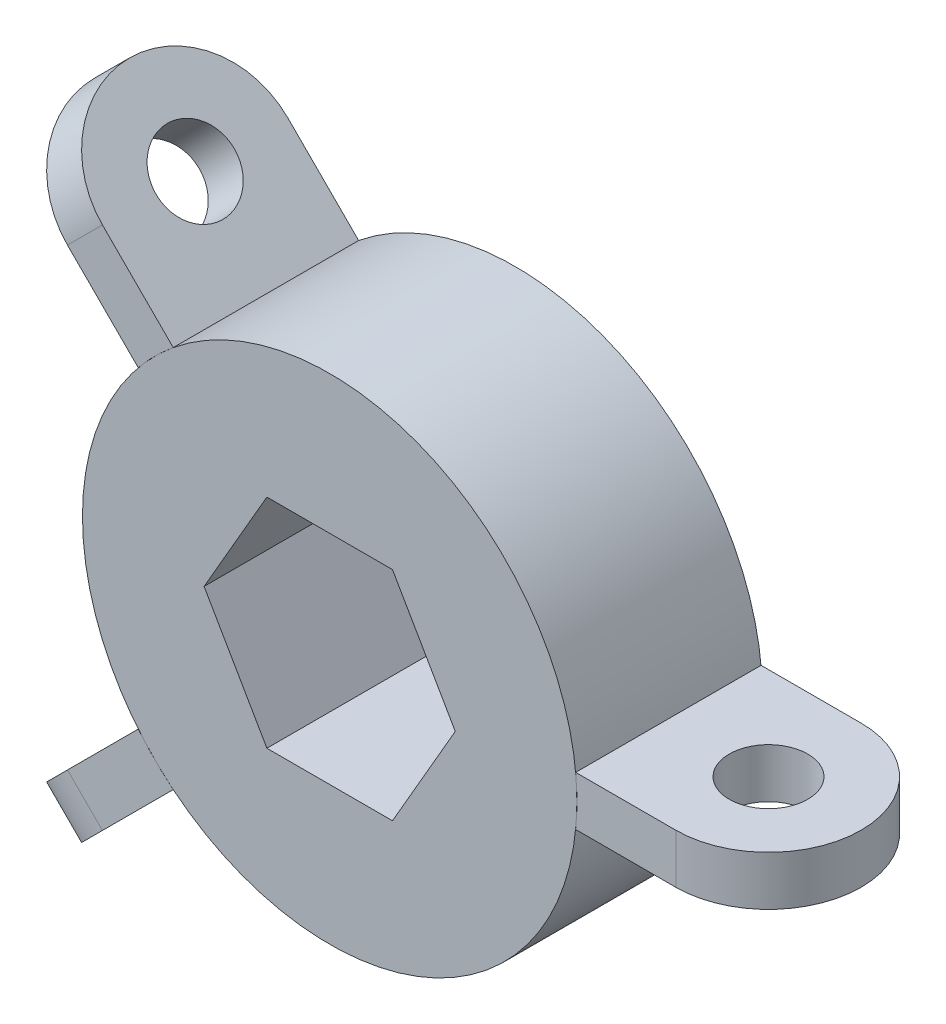
ISO-10303-21;
HEADER;
FILE_DESCRIPTION(('STEP AP214'),'2;1');
FILE_NAME('part.step','',(''),(''),'','','');
FILE_SCHEMA(('AUTOMOTIVE_DESIGN { 1 0 10303 214 1 1 1 1 }'));
ENDSEC;
DATA;
#1=APPLICATION_CONTEXT('core data for automotive mechanical design processes');
#2=APPLICATION_PROTOCOL_DEFINITION('international standard','automotive_design',2000,#1);
#3=PRODUCT_CONTEXT('',#1,'mechanical');
#4=PRODUCT('Part','Part','',(#3));
#5=PRODUCT_RELATED_PRODUCT_CATEGORY('part','',(#4));
#6=PRODUCT_DEFINITION_FORMATION('','',#4);
#7=PRODUCT_DEFINITION_CONTEXT('part definition',#1,'design');
#8=PRODUCT_DEFINITION('design','',#6,#7);
#9=PRODUCT_DEFINITION_SHAPE('','',#8);
#10=(LENGTH_UNIT() NAMED_UNIT(*) SI_UNIT(.MILLI.,.METRE.));
#11=(NAMED_UNIT(*) PLANE_ANGLE_UNIT() SI_UNIT($,.RADIAN.));
#12=(NAMED_UNIT(*) SI_UNIT($,.STERADIAN.) SOLID_ANGLE_UNIT());
#13=UNCERTAINTY_MEASURE_WITH_UNIT(LENGTH_MEASURE(1.E-05),#10,'distance_accuracy_value','');
#14=(GEOMETRIC_REPRESENTATION_CONTEXT(3) GLOBAL_UNCERTAINTY_ASSIGNED_CONTEXT((#13)) GLOBAL_UNIT_ASSIGNED_CONTEXT((#10,
#11,#12)) REPRESENTATION_CONTEXT('',''));
#15=CARTESIAN_POINT('',(0.,0.,0.));
#16=DIRECTION('',(0.,0.,1.));
#17=DIRECTION('',(1.,0.,0.));
#18=AXIS2_PLACEMENT_3D('',#15,#16,#17);
#19=CARTESIAN_POINT('',(-19.7989898732232,19.7989898732235,15.));
#20=DIRECTION('',(0.,0.,1.));
#21=DIRECTION('',(-0.707106781186541,0.707106781186554,0.));
#22=AXIS2_PLACEMENT_3D('',#19,#20,#21);
#23=PLANE('',#22);
#24=CARTESIAN_POINT('',(0.,0.,15.));
#25=DIRECTION('',(0.,0.,-1.));
#26=DIRECTION('',(0.707106781186541,-0.707106781186554,0.));
#27=AXIS2_PLACEMENT_3D('',#24,#25,#26);
#28=CIRCLE('',#27,20.);
#29=CARTESIAN_POINT('',(-12.6570337170971,15.4854608418435,15.));
#30=VERTEX_POINT('',#29);
#31=CARTESIAN_POINT('',(-15.4854608418433,12.6570337170973,15.));
#32=VERTEX_POINT('',#31);
#33=EDGE_CURVE('E95',#30,#32,#28,.F.);
#34=ORIENTED_EDGE('',*,*,#33,.F.);
#35=DIRECTION('',(0.707106781186541,-0.707106781186554,0.));
#36=VECTOR('',#35,1.);
#37=CARTESIAN_POINT('',(-18.3847763108501,21.2132034355966,15.));
#38=LINE('',#37,#36);
#39=CARTESIAN_POINT('',(-18.3847763108501,21.2132034355966,15.));
#40=VERTEX_POINT('',#39);
#41=EDGE_CURVE('E12',#40,#30,#38,.T.);
#42=ORIENTED_EDGE('',*,*,#41,.F.);
#43=DIRECTION('',(-0.707106781186554,-0.707106781186541,0.));
#44=VECTOR('',#43,1.);
#45=CARTESIAN_POINT('',(-19.7989898732232,19.7989898732235,15.));
#46=LINE('',#45,#44);
#47=CARTESIAN_POINT('',(-21.2132034355963,18.3847763108504,15.));
#48=VERTEX_POINT('',#47);
#49=EDGE_CURVE('E86',#40,#48,#46,.T.);
#50=ORIENTED_EDGE('',*,*,#49,.T.);
#51=DIRECTION('',(0.707106781186541,-0.707106781186554,0.));
#52=VECTOR('',#51,1.);
#53=CARTESIAN_POINT('',(-21.2132034355963,18.3847763108504,15.));
#54=LINE('',#53,#52);
#55=EDGE_CURVE('E89',#48,#32,#54,.T.);
#56=ORIENTED_EDGE('',*,*,#55,.T.);
#57=EDGE_LOOP('',(#34,#42,#50,#56));
#58=FACE_BOUND('',#57,.T.);
#59=ADVANCED_FACE('F48',(#58),#23,.T.);
#60=CARTESIAN_POINT('',(-18.3847763108501,21.2132034355966,0.));
#61=DIRECTION('',(0.707106781186554,0.707106781186541,0.));
#62=DIRECTION('',(0.,0.,-1.));
#63=AXIS2_PLACEMENT_3D('',#60,#61,#62);
#64=PLANE('',#63);
#65=CARTESIAN_POINT('',(-18.3847763108501,21.2132034355966,7.5));
#66=DIRECTION('',(0.707106781186554,0.707106781186541,0.));
#67=DIRECTION('',(0.,0.,-1.));
#68=AXIS2_PLACEMENT_3D('',#65,#66,#67);
#69=CIRCLE('',#68,3.175);
#70=CARTESIAN_POINT('',(-18.3847763108501,21.2132034355966,4.325));
#71=VERTEX_POINT('',#70);
#72=EDGE_CURVE('E151',#71,#71,#69,.T.);
#73=ORIENTED_EDGE('',*,*,#72,.F.);
#74=EDGE_LOOP('',(#73));
#75=FACE_BOUND('',#74,.T.);
#76=ORIENTED_EDGE('',*,*,#41,.T.);
#77=DIRECTION('',(0.,0.,-1.));
#78=VECTOR('',#77,1.);
#79=CARTESIAN_POINT('',(-12.6570337170971,15.4854608418435,15.));
#80=LINE('',#79,#78);
#81=CARTESIAN_POINT('',(-12.6570337170971,15.4854608418435,0.));
#82=VERTEX_POINT('',#81);
#83=EDGE_CURVE('E106',#82,#30,#80,.F.);
#84=ORIENTED_EDGE('',*,*,#83,.F.);
#85=DIRECTION('',(0.707106781186541,-0.707106781186554,0.));
#86=VECTOR('',#85,1.);
#87=CARTESIAN_POINT('',(-18.3847763108501,21.2132034355966,0.));
#88=LINE('',#87,#86);
#89=CARTESIAN_POINT('',(-18.3847763108501,21.2132034355966,0.));
#90=VERTEX_POINT('',#89);
#91=EDGE_CURVE('E55',#90,#82,#88,.T.);
#92=ORIENTED_EDGE('',*,*,#91,.F.);
#93=CARTESIAN_POINT('',(-18.3847763108501,21.2132034355966,7.5));
#94=DIRECTION('',(0.707106781186554,0.707106781186541,0.));
#95=DIRECTION('',(0.,0.,1.));
#96=AXIS2_PLACEMENT_3D('',#93,#94,#95);
#97=CIRCLE('',#96,7.5);
#98=EDGE_CURVE('E107',#90,#40,#97,.T.);
#99=ORIENTED_EDGE('',*,*,#98,.T.);
#100=EDGE_LOOP('',(#76,#84,#92,#99));
#101=FACE_BOUND('',#100,.T.);
#102=ADVANCED_FACE('F125',(#75,#101),#64,.T.);
#103=CARTESIAN_POINT('',(-19.7989898732232,19.7989898732235,0.));
#104=DIRECTION('',(0.,0.,1.));
#105=DIRECTION('',(0.707106781186554,0.707106781186541,0.));
#106=AXIS2_PLACEMENT_3D('',#103,#104,#105);
#107=PLANE('',#106);
#108=ORIENTED_EDGE('',*,*,#91,.T.);
#109=CARTESIAN_POINT('',(0.,0.,0.));
#110=DIRECTION('',(0.,0.,-1.));
#111=DIRECTION('',(-0.707106781186554,-0.707106781186541,0.));
#112=AXIS2_PLACEMENT_3D('',#109,#110,#111);
#113=CIRCLE('',#112,20.);
#114=CARTESIAN_POINT('',(-15.4854608418433,12.6570337170973,0.));
#115=VERTEX_POINT('',#114);
#116=EDGE_CURVE('E110',#82,#115,#113,.F.);
#117=ORIENTED_EDGE('',*,*,#116,.T.);
#118=DIRECTION('',(0.707106781186541,-0.707106781186554,0.));
#119=VECTOR('',#118,1.);
#120=CARTESIAN_POINT('',(-21.2132034355963,18.3847763108504,0.));
#121=LINE('',#120,#119);
#122=CARTESIAN_POINT('',(-21.2132034355963,18.3847763108504,0.));
#123=VERTEX_POINT('',#122);
#124=EDGE_CURVE('E62',#123,#115,#121,.T.);
#125=ORIENTED_EDGE('',*,*,#124,.F.);
#126=DIRECTION('',(-0.707106781186554,-0.707106781186541,0.));
#127=VECTOR('',#126,1.);
#128=CARTESIAN_POINT('',(-19.7989898732232,19.7989898732235,0.));
#129=LINE('',#128,#127);
#130=EDGE_CURVE('E94',#90,#123,#129,.T.);
#131=ORIENTED_EDGE('',*,*,#130,.F.);
#132=EDGE_LOOP('',(#108,#117,#125,#131));
#133=FACE_BOUND('',#132,.T.);
#134=ADVANCED_FACE('F122',(#133),#107,.F.);
#135=CARTESIAN_POINT('',(-21.2132034355963,18.3847763108504,0.));
#136=DIRECTION('',(0.707106781186554,0.707106781186541,0.));
#137=DIRECTION('',(0.,0.,-1.));
#138=AXIS2_PLACEMENT_3D('',#135,#136,#137);
#139=PLANE('',#138);
#140=CARTESIAN_POINT('',(-21.2132034355963,18.3847763108504,7.5));
#141=DIRECTION('',(0.707106781186554,0.707106781186541,0.));
#142=DIRECTION('',(0.,0.,-1.));
#143=AXIS2_PLACEMENT_3D('',#140,#141,#142);
#144=CIRCLE('',#143,3.175);
#145=CARTESIAN_POINT('',(-21.2132034355963,18.3847763108504,4.325));
#146=VERTEX_POINT('',#145);
#147=EDGE_CURVE('E112',#146,#146,#144,.F.);
#148=ORIENTED_EDGE('',*,*,#147,.F.);
#149=EDGE_LOOP('',(#148));
#150=FACE_BOUND('',#149,.T.);
#151=ORIENTED_EDGE('',*,*,#124,.T.);
#152=DIRECTION('',(0.,0.,-1.));
#153=VECTOR('',#152,1.);
#154=CARTESIAN_POINT('',(-15.4854608418433,12.6570337170973,15.));
#155=LINE('',#154,#153);
#156=EDGE_CURVE('E103',#115,#32,#155,.F.);
#157=ORIENTED_EDGE('',*,*,#156,.T.);
#158=ORIENTED_EDGE('',*,*,#55,.F.);
#159=CARTESIAN_POINT('',(-21.2132034355963,18.3847763108504,7.5));
#160=DIRECTION('',(0.707106781186554,0.707106781186541,0.));
#161=DIRECTION('',(0.,0.,-1.));
#162=AXIS2_PLACEMENT_3D('',#159,#160,#161);
#163=CIRCLE('',#162,7.5);
#164=EDGE_CURVE('E100',#48,#123,#163,.F.);
#165=ORIENTED_EDGE('',*,*,#164,.T.);
#166=EDGE_LOOP('',(#151,#157,#158,#165));
#167=FACE_BOUND('',#166,.T.);
#168=ADVANCED_FACE('F99',(#150,#167),#139,.F.);
#169=CARTESIAN_POINT('',(0.,0.,15.));
#170=DIRECTION('',(0.,0.,-1.));
#171=DIRECTION('',(0.707106781186541,-0.707106781186554,0.));
#172=AXIS2_PLACEMENT_3D('',#169,#170,#171);
#173=CYLINDRICAL_SURFACE('',#172,20.);
#174=ORIENTED_EDGE('',*,*,#116,.F.);
#175=ORIENTED_EDGE('',*,*,#83,.T.);
#176=ORIENTED_EDGE('',*,*,#33,.T.);
#177=ORIENTED_EDGE('',*,*,#156,.F.);
#178=EDGE_LOOP('',(#174,#175,#176,#177));
#179=FACE_BOUND('',#178,.T.);
#180=ADVANCED_FACE('F124',(#179),#173,.F.);
#181=CARTESIAN_POINT('',(-33.0717446612278,6.5262350852191,7.5));
#182=DIRECTION('',(0.707106781186554,0.707106781186541,0.));
#183=DIRECTION('',(0.,0.,-1.));
#184=AXIS2_PLACEMENT_3D('',#181,#182,#183);
#185=CYLINDRICAL_SURFACE('',#184,7.5);
#186=ORIENTED_EDGE('',*,*,#164,.F.);
#187=ORIENTED_EDGE('',*,*,#49,.F.);
#188=ORIENTED_EDGE('',*,*,#98,.F.);
#189=ORIENTED_EDGE('',*,*,#130,.T.);
#190=EDGE_LOOP('',(#186,#187,#188,#189));
#191=FACE_BOUND('',#190,.T.);
#192=ADVANCED_FACE('F105',(#191),#185,.T.);
#193=CARTESIAN_POINT('',(-27.5632034355963,12.0347763108505,7.5));
#194=DIRECTION('',(0.707106781186554,0.707106781186541,0.));
#195=DIRECTION('',(0.,0.,-1.));
#196=AXIS2_PLACEMENT_3D('',#193,#194,#195);
#197=CYLINDRICAL_SURFACE('',#196,3.175);
#198=ORIENTED_EDGE('',*,*,#147,.T.);
#199=EDGE_LOOP('',(#198));
#200=FACE_BOUND('',#199,.T.);
#201=ORIENTED_EDGE('',*,*,#72,.T.);
#202=EDGE_LOOP('',(#201));
#203=FACE_BOUND('',#202,.T.);
#204=ADVANCED_FACE('F142',(#200,#203),#197,.F.);
#205=CLOSED_SHELL('',(#59,#102,#134,#168,#180,#192,#204));
#206=MANIFOLD_SOLID_BREP('B2',#205);
#207=CARTESIAN_POINT('',(-19.7989898732234,-19.7989898732232,15.));
#208=DIRECTION('',(0.,0.,1.));
#209=DIRECTION('',(-0.707106781186551,-0.707106781186544,0.));
#210=AXIS2_PLACEMENT_3D('',#207,#208,#209);
#211=PLANE('',#210);
#212=CARTESIAN_POINT('',(0.,0.,15.));
#213=DIRECTION('',(0.,0.,-1.));
#214=DIRECTION('',(0.707106781186551,0.707106781186544,0.));
#215=AXIS2_PLACEMENT_3D('',#212,#213,#214);
#216=CIRCLE('',#215,20.);
#217=CARTESIAN_POINT('',(-15.4854608418434,-12.6570337170971,15.));
#218=VERTEX_POINT('',#217);
#219=CARTESIAN_POINT('',(-12.6570337170973,-15.4854608418433,15.));
#220=VERTEX_POINT('',#219);
#221=EDGE_CURVE('E259',#218,#220,#216,.F.);
#222=ORIENTED_EDGE('',*,*,#221,.F.);
#223=DIRECTION('',(0.707106781186551,0.707106781186544,0.));
#224=VECTOR('',#223,1.);
#225=CARTESIAN_POINT('',(-21.2132034355965,-18.3847763108501,15.));
#226=LINE('',#225,#224);
#227=CARTESIAN_POINT('',(-21.2132034355965,-18.3847763108501,15.));
#228=VERTEX_POINT('',#227);
#229=EDGE_CURVE('E46',#228,#218,#226,.T.);
#230=ORIENTED_EDGE('',*,*,#229,.F.);
#231=DIRECTION('',(0.707106781186544,-0.707106781186551,0.));
#232=VECTOR('',#231,1.);
#233=CARTESIAN_POINT('',(-19.7989898732234,-19.7989898732232,15.));
#234=LINE('',#233,#232);
#235=CARTESIAN_POINT('',(-18.3847763108503,-21.2132034355963,15.));
#236=VERTEX_POINT('',#235);
#237=EDGE_CURVE('E250',#228,#236,#234,.T.);
#238=ORIENTED_EDGE('',*,*,#237,.T.);
#239=DIRECTION('',(0.707106781186551,0.707106781186544,0.));
#240=VECTOR('',#239,1.);
#241=CARTESIAN_POINT('',(-18.3847763108503,-21.2132034355963,15.));
#242=LINE('',#241,#240);
#243=EDGE_CURVE('E253',#236,#220,#242,.T.);
#244=ORIENTED_EDGE('',*,*,#243,.T.);
#245=EDGE_LOOP('',(#222,#230,#238,#244));
#246=FACE_BOUND('',#245,.T.);
#247=ADVANCED_FACE('F212',(#246),#211,.T.);
#248=CARTESIAN_POINT('',(-21.2132034355965,-18.3847763108501,0.));
#249=DIRECTION('',(-0.707106781186544,0.707106781186551,0.));
#250=DIRECTION('',(0.,0.,-1.));
#251=AXIS2_PLACEMENT_3D('',#248,#249,#250);
#252=PLANE('',#251);
#253=CARTESIAN_POINT('',(-21.2132034355965,-18.3847763108501,7.5));
#254=DIRECTION('',(-0.707106781186544,0.707106781186551,0.));
#255=DIRECTION('',(0.,0.,-1.));
#256=AXIS2_PLACEMENT_3D('',#253,#254,#255);
#257=CIRCLE('',#256,3.175);
#258=CARTESIAN_POINT('',(-21.2132034355965,-18.3847763108501,4.325));
#259=VERTEX_POINT('',#258);
#260=EDGE_CURVE('E315',#259,#259,#257,.T.);
#261=ORIENTED_EDGE('',*,*,#260,.F.);
#262=EDGE_LOOP('',(#261));
#263=FACE_BOUND('',#262,.T.);
#264=ORIENTED_EDGE('',*,*,#229,.T.);
#265=DIRECTION('',(0.,0.,-1.));
#266=VECTOR('',#265,1.);
#267=CARTESIAN_POINT('',(-15.4854608418434,-12.6570337170971,15.));
#268=LINE('',#267,#266);
#269=CARTESIAN_POINT('',(-15.4854608418434,-12.6570337170971,0.));
#270=VERTEX_POINT('',#269);
#271=EDGE_CURVE('E270',#270,#218,#268,.F.);
#272=ORIENTED_EDGE('',*,*,#271,.F.);
#273=DIRECTION('',(0.707106781186551,0.707106781186544,0.));
#274=VECTOR('',#273,1.);
#275=CARTESIAN_POINT('',(-21.2132034355965,-18.3847763108501,0.));
#276=LINE('',#275,#274);
#277=CARTESIAN_POINT('',(-21.2132034355965,-18.3847763108501,0.));
#278=VERTEX_POINT('',#277);
#279=EDGE_CURVE('E219',#278,#270,#276,.T.);
#280=ORIENTED_EDGE('',*,*,#279,.F.);
#281=CARTESIAN_POINT('',(-21.2132034355965,-18.3847763108501,7.5));
#282=DIRECTION('',(-0.707106781186544,0.707106781186551,0.));
#283=DIRECTION('',(0.,0.,1.));
#284=AXIS2_PLACEMENT_3D('',#281,#282,#283);
#285=CIRCLE('',#284,7.5);
#286=EDGE_CURVE('E271',#278,#228,#285,.T.);
#287=ORIENTED_EDGE('',*,*,#286,.T.);
#288=EDGE_LOOP('',(#264,#272,#280,#287));
#289=FACE_BOUND('',#288,.T.);
#290=ADVANCED_FACE('F289',(#263,#289),#252,.T.);
#291=CARTESIAN_POINT('',(-19.7989898732234,-19.7989898732232,0.));
#292=DIRECTION('',(0.,0.,1.));
#293=DIRECTION('',(-0.707106781186544,0.707106781186551,0.));
#294=AXIS2_PLACEMENT_3D('',#291,#292,#293);
#295=PLANE('',#294);
#296=ORIENTED_EDGE('',*,*,#279,.T.);
#297=CARTESIAN_POINT('',(0.,0.,0.));
#298=DIRECTION('',(0.,0.,-1.));
#299=DIRECTION('',(0.707106781186544,-0.707106781186551,0.));
#300=AXIS2_PLACEMENT_3D('',#297,#298,#299);
#301=CIRCLE('',#300,20.);
#302=CARTESIAN_POINT('',(-12.6570337170973,-15.4854608418433,0.));
#303=VERTEX_POINT('',#302);
#304=EDGE_CURVE('E274',#270,#303,#301,.F.);
#305=ORIENTED_EDGE('',*,*,#304,.T.);
#306=DIRECTION('',(0.707106781186551,0.707106781186544,0.));
#307=VECTOR('',#306,1.);
#308=CARTESIAN_POINT('',(-18.3847763108503,-21.2132034355963,0.));
#309=LINE('',#308,#307);
#310=CARTESIAN_POINT('',(-18.3847763108503,-21.2132034355963,0.));
#311=VERTEX_POINT('',#310);
#312=EDGE_CURVE('E226',#311,#303,#309,.T.);
#313=ORIENTED_EDGE('',*,*,#312,.F.);
#314=DIRECTION('',(0.707106781186544,-0.707106781186551,0.));
#315=VECTOR('',#314,1.);
#316=CARTESIAN_POINT('',(-19.7989898732234,-19.7989898732232,0.));
#317=LINE('',#316,#315);
#318=EDGE_CURVE('E258',#278,#311,#317,.T.);
#319=ORIENTED_EDGE('',*,*,#318,.F.);
#320=EDGE_LOOP('',(#296,#305,#313,#319));
#321=FACE_BOUND('',#320,.T.);
#322=ADVANCED_FACE('F286',(#321),#295,.F.);
#323=CARTESIAN_POINT('',(-18.3847763108503,-21.2132034355963,0.));
#324=DIRECTION('',(-0.707106781186544,0.707106781186551,0.));
#325=DIRECTION('',(0.,0.,-1.));
#326=AXIS2_PLACEMENT_3D('',#323,#324,#325);
#327=PLANE('',#326);
#328=CARTESIAN_POINT('',(-18.3847763108503,-21.2132034355963,7.5));
#329=DIRECTION('',(-0.707106781186544,0.707106781186551,0.));
#330=DIRECTION('',(0.,0.,-1.));
#331=AXIS2_PLACEMENT_3D('',#328,#329,#330);
#332=CIRCLE('',#331,3.175);
#333=CARTESIAN_POINT('',(-18.3847763108503,-21.2132034355963,4.325));
#334=VERTEX_POINT('',#333);
#335=EDGE_CURVE('E276',#334,#334,#332,.F.);
#336=ORIENTED_EDGE('',*,*,#335,.F.);
#337=EDGE_LOOP('',(#336));
#338=FACE_BOUND('',#337,.T.);
#339=ORIENTED_EDGE('',*,*,#312,.T.);
#340=DIRECTION('',(0.,0.,-1.));
#341=VECTOR('',#340,1.);
#342=CARTESIAN_POINT('',(-12.6570337170973,-15.4854608418433,15.));
#343=LINE('',#342,#341);
#344=EDGE_CURVE('E267',#303,#220,#343,.F.);
#345=ORIENTED_EDGE('',*,*,#344,.T.);
#346=ORIENTED_EDGE('',*,*,#243,.F.);
#347=CARTESIAN_POINT('',(-18.3847763108503,-21.2132034355963,7.5));
#348=DIRECTION('',(-0.707106781186544,0.707106781186551,0.));
#349=DIRECTION('',(0.,0.,-1.));
#350=AXIS2_PLACEMENT_3D('',#347,#348,#349);
#351=CIRCLE('',#350,7.5);
#352=EDGE_CURVE('E264',#236,#311,#351,.F.);
#353=ORIENTED_EDGE('',*,*,#352,.T.);
#354=EDGE_LOOP('',(#339,#345,#346,#353));
#355=FACE_BOUND('',#354,.T.);
#356=ADVANCED_FACE('F263',(#338,#355),#327,.F.);
#357=CARTESIAN_POINT('',(0.,0.,15.));
#358=DIRECTION('',(0.,0.,-1.));
#359=DIRECTION('',(0.707106781186551,0.707106781186544,0.));
#360=AXIS2_PLACEMENT_3D('',#357,#358,#359);
#361=CYLINDRICAL_SURFACE('',#360,20.);
#362=ORIENTED_EDGE('',*,*,#304,.F.);
#363=ORIENTED_EDGE('',*,*,#271,.T.);
#364=ORIENTED_EDGE('',*,*,#221,.T.);
#365=ORIENTED_EDGE('',*,*,#344,.F.);
#366=EDGE_LOOP('',(#362,#363,#364,#365));
#367=FACE_BOUND('',#366,.T.);
#368=ADVANCED_FACE('F288',(#367),#361,.F.);
#369=CARTESIAN_POINT('',(-6.52623508521899,-33.0717446612278,7.5));
#370=DIRECTION('',(-0.707106781186544,0.707106781186551,0.));
#371=DIRECTION('',(0.,0.,-1.));
#372=AXIS2_PLACEMENT_3D('',#369,#370,#371);
#373=CYLINDRICAL_SURFACE('',#372,7.5);
#374=ORIENTED_EDGE('',*,*,#352,.F.);
#375=ORIENTED_EDGE('',*,*,#237,.F.);
#376=ORIENTED_EDGE('',*,*,#286,.F.);
#377=ORIENTED_EDGE('',*,*,#318,.T.);
#378=EDGE_LOOP('',(#374,#375,#376,#377));
#379=FACE_BOUND('',#378,.T.);
#380=ADVANCED_FACE('F269',(#379),#373,.T.);
#381=CARTESIAN_POINT('',(-12.0347763108504,-27.5632034355964,7.5));
#382=DIRECTION('',(-0.707106781186544,0.707106781186551,0.));
#383=DIRECTION('',(0.,0.,-1.));
#384=AXIS2_PLACEMENT_3D('',#381,#382,#383);
#385=CYLINDRICAL_SURFACE('',#384,3.175);
#386=ORIENTED_EDGE('',*,*,#335,.T.);
#387=EDGE_LOOP('',(#386));
#388=FACE_BOUND('',#387,.T.);
#389=ORIENTED_EDGE('',*,*,#260,.T.);
#390=EDGE_LOOP('',(#389));
#391=FACE_BOUND('',#390,.T.);
#392=ADVANCED_FACE('F306',(#388,#391),#385,.F.);
#393=CLOSED_SHELL('',(#247,#290,#322,#356,#368,#380,#392));
#394=MANIFOLD_SOLID_BREP('B6',#393);
#395=CARTESIAN_POINT('',(28.,0.,15.));
#396=DIRECTION('',(0.,0.,1.));
#397=DIRECTION('',(1.,0.,0.));
#398=AXIS2_PLACEMENT_3D('',#395,#396,#397);
#399=PLANE('',#398);
#400=CARTESIAN_POINT('',(0.,0.,15.));
#401=DIRECTION('',(0.,0.,-1.));
#402=DIRECTION('',(-1.,0.,0.));
#403=AXIS2_PLACEMENT_3D('',#400,#401,#402);
#404=CIRCLE('',#403,20.);
#405=CARTESIAN_POINT('',(19.8997487421324,-2.,15.));
#406=VERTEX_POINT('',#405);
#407=CARTESIAN_POINT('',(19.8997487421324,2.,15.));
#408=VERTEX_POINT('',#407);
#409=EDGE_CURVE('E422',#406,#408,#404,.F.);
#410=ORIENTED_EDGE('',*,*,#409,.F.);
#411=DIRECTION('',(-1.,0.,0.));
#412=VECTOR('',#411,1.);
#413=CARTESIAN_POINT('',(28.,-2.,15.));
#414=LINE('',#413,#412);
#415=CARTESIAN_POINT('',(28.,-2.,15.));
#416=VERTEX_POINT('',#415);
#417=EDGE_CURVE('E210',#416,#406,#414,.T.);
#418=ORIENTED_EDGE('',*,*,#417,.F.);
#419=DIRECTION('',(0.,1.,0.));
#420=VECTOR('',#419,1.);
#421=CARTESIAN_POINT('',(28.,0.,15.));
#422=LINE('',#421,#420);
#423=CARTESIAN_POINT('',(28.,2.,15.));
#424=VERTEX_POINT('',#423);
#425=EDGE_CURVE('E413',#416,#424,#422,.T.);
#426=ORIENTED_EDGE('',*,*,#425,.T.);
#427=DIRECTION('',(-1.,0.,0.));
#428=VECTOR('',#427,1.);
#429=CARTESIAN_POINT('',(28.,2.,15.));
#430=LINE('',#429,#428);
#431=EDGE_CURVE('E416',#424,#408,#430,.T.);
#432=ORIENTED_EDGE('',*,*,#431,.T.);
#433=EDGE_LOOP('',(#410,#418,#426,#432));
#434=FACE_BOUND('',#433,.T.);
#435=ADVANCED_FACE('F375',(#434),#399,.T.);
#436=CARTESIAN_POINT('',(28.,-2.,0.));
#437=DIRECTION('',(0.,-1.,0.));
#438=DIRECTION('',(0.,0.,-1.));
#439=AXIS2_PLACEMENT_3D('',#436,#437,#438);
#440=PLANE('',#439);
#441=CARTESIAN_POINT('',(28.,-2.,7.5));
#442=DIRECTION('',(0.,-1.,0.));
#443=DIRECTION('',(0.,0.,-1.));
#444=AXIS2_PLACEMENT_3D('',#441,#442,#443);
#445=CIRCLE('',#444,3.175);
#446=CARTESIAN_POINT('',(28.,-2.,4.325));
#447=VERTEX_POINT('',#446);
#448=EDGE_CURVE('E478',#447,#447,#445,.T.);
#449=ORIENTED_EDGE('',*,*,#448,.F.);
#450=EDGE_LOOP('',(#449));
#451=FACE_BOUND('',#450,.T.);
#452=ORIENTED_EDGE('',*,*,#417,.T.);
#453=DIRECTION('',(0.,0.,-1.));
#454=VECTOR('',#453,1.);
#455=CARTESIAN_POINT('',(19.8997487421324,-2.,15.));
#456=LINE('',#455,#454);
#457=CARTESIAN_POINT('',(19.8997487421324,-2.,0.));
#458=VERTEX_POINT('',#457);
#459=EDGE_CURVE('E433',#458,#406,#456,.F.);
#460=ORIENTED_EDGE('',*,*,#459,.F.);
#461=DIRECTION('',(-1.,0.,0.));
#462=VECTOR('',#461,1.);
#463=CARTESIAN_POINT('',(28.,-2.,0.));
#464=LINE('',#463,#462);
#465=CARTESIAN_POINT('',(28.,-2.,0.));
#466=VERTEX_POINT('',#465);
#467=EDGE_CURVE('E382',#466,#458,#464,.T.);
#468=ORIENTED_EDGE('',*,*,#467,.F.);
#469=CARTESIAN_POINT('',(28.,-2.,7.5));
#470=DIRECTION('',(0.,-1.,0.));
#471=DIRECTION('',(0.,0.,1.));
#472=AXIS2_PLACEMENT_3D('',#469,#470,#471);
#473=CIRCLE('',#472,7.5);
#474=EDGE_CURVE('E434',#466,#416,#473,.T.);
#475=ORIENTED_EDGE('',*,*,#474,.T.);
#476=EDGE_LOOP('',(#452,#460,#468,#475));
#477=FACE_BOUND('',#476,.T.);
#478=ADVANCED_FACE('F452',(#451,#477),#440,.T.);
#479=CARTESIAN_POINT('',(28.,0.,0.));
#480=DIRECTION('',(0.,0.,1.));
#481=DIRECTION('',(0.,-1.,0.));
#482=AXIS2_PLACEMENT_3D('',#479,#480,#481);
#483=PLANE('',#482);
#484=ORIENTED_EDGE('',*,*,#467,.T.);
#485=CARTESIAN_POINT('',(0.,0.,0.));
#486=DIRECTION('',(0.,0.,-1.));
#487=DIRECTION('',(0.,1.,0.));
#488=AXIS2_PLACEMENT_3D('',#485,#486,#487);
#489=CIRCLE('',#488,20.);
#490=CARTESIAN_POINT('',(19.8997487421324,2.,0.));
#491=VERTEX_POINT('',#490);
#492=EDGE_CURVE('E437',#458,#491,#489,.F.);
#493=ORIENTED_EDGE('',*,*,#492,.T.);
#494=DIRECTION('',(-1.,0.,0.));
#495=VECTOR('',#494,1.);
#496=CARTESIAN_POINT('',(28.,2.,0.));
#497=LINE('',#496,#495);
#498=CARTESIAN_POINT('',(28.,2.,0.));
#499=VERTEX_POINT('',#498);
#500=EDGE_CURVE('E389',#499,#491,#497,.T.);
#501=ORIENTED_EDGE('',*,*,#500,.F.);
#502=DIRECTION('',(0.,1.,0.));
#503=VECTOR('',#502,1.);
#504=CARTESIAN_POINT('',(28.,0.,0.));
#505=LINE('',#504,#503);
#506=EDGE_CURVE('E421',#466,#499,#505,.T.);
#507=ORIENTED_EDGE('',*,*,#506,.F.);
#508=EDGE_LOOP('',(#484,#493,#501,#507));
#509=FACE_BOUND('',#508,.T.);
#510=ADVANCED_FACE('F449',(#509),#483,.F.);
#511=CARTESIAN_POINT('',(28.,2.,0.));
#512=DIRECTION('',(0.,-1.,0.));
#513=DIRECTION('',(0.,0.,-1.));
#514=AXIS2_PLACEMENT_3D('',#511,#512,#513);
#515=PLANE('',#514);
#516=CARTESIAN_POINT('',(28.,2.,7.5));
#517=DIRECTION('',(0.,-1.,0.));
#518=DIRECTION('',(0.,0.,-1.));
#519=AXIS2_PLACEMENT_3D('',#516,#517,#518);
#520=CIRCLE('',#519,3.175);
#521=CARTESIAN_POINT('',(28.,2.,4.325));
#522=VERTEX_POINT('',#521);
#523=EDGE_CURVE('E439',#522,#522,#520,.F.);
#524=ORIENTED_EDGE('',*,*,#523,.F.);
#525=EDGE_LOOP('',(#524));
#526=FACE_BOUND('',#525,.T.);
#527=ORIENTED_EDGE('',*,*,#500,.T.);
#528=DIRECTION('',(0.,0.,-1.));
#529=VECTOR('',#528,1.);
#530=CARTESIAN_POINT('',(19.8997487421324,2.,15.));
#531=LINE('',#530,#529);
#532=EDGE_CURVE('E430',#491,#408,#531,.F.);
#533=ORIENTED_EDGE('',*,*,#532,.T.);
#534=ORIENTED_EDGE('',*,*,#431,.F.);
#535=CARTESIAN_POINT('',(28.,2.,7.5));
#536=DIRECTION('',(0.,-1.,0.));
#537=DIRECTION('',(0.,0.,-1.));
#538=AXIS2_PLACEMENT_3D('',#535,#536,#537);
#539=CIRCLE('',#538,7.5);
#540=EDGE_CURVE('E427',#424,#499,#539,.F.);
#541=ORIENTED_EDGE('',*,*,#540,.T.);
#542=EDGE_LOOP('',(#527,#533,#534,#541));
#543=FACE_BOUND('',#542,.T.);
#544=ADVANCED_FACE('F426',(#526,#543),#515,.F.);
#545=CARTESIAN_POINT('',(0.,0.,15.));
#546=DIRECTION('',(0.,0.,-1.));
#547=DIRECTION('',(-1.,0.,0.));
#548=AXIS2_PLACEMENT_3D('',#545,#546,#547);
#549=CYLINDRICAL_SURFACE('',#548,20.);
#550=ORIENTED_EDGE('',*,*,#492,.F.);
#551=ORIENTED_EDGE('',*,*,#459,.T.);
#552=ORIENTED_EDGE('',*,*,#409,.T.);
#553=ORIENTED_EDGE('',*,*,#532,.F.);
#554=EDGE_LOOP('',(#550,#551,#552,#553));
#555=FACE_BOUND('',#554,.T.);
#556=ADVANCED_FACE('F451',(#555),#549,.F.);
#557=CARTESIAN_POINT('',(28.,18.7705098312484,7.5));
#558=DIRECTION('',(0.,-1.,0.));
#559=DIRECTION('',(0.,0.,-1.));
#560=AXIS2_PLACEMENT_3D('',#557,#558,#559);
#561=CYLINDRICAL_SURFACE('',#560,7.5);
#562=ORIENTED_EDGE('',*,*,#540,.F.);
#563=ORIENTED_EDGE('',*,*,#425,.F.);
#564=ORIENTED_EDGE('',*,*,#474,.F.);
#565=ORIENTED_EDGE('',*,*,#506,.T.);
#566=EDGE_LOOP('',(#562,#563,#564,#565));
#567=FACE_BOUND('',#566,.T.);
#568=ADVANCED_FACE('F432',(#567),#561,.T.);
#569=CARTESIAN_POINT('',(28.,10.9802561210692,7.5));
#570=DIRECTION('',(0.,-1.,0.));
#571=DIRECTION('',(0.,0.,-1.));
#572=AXIS2_PLACEMENT_3D('',#569,#570,#571);
#573=CYLINDRICAL_SURFACE('',#572,3.175);
#574=ORIENTED_EDGE('',*,*,#523,.T.);
#575=EDGE_LOOP('',(#574));
#576=FACE_BOUND('',#575,.T.);
#577=ORIENTED_EDGE('',*,*,#448,.T.);
#578=EDGE_LOOP('',(#577));
#579=FACE_BOUND('',#578,.T.);
#580=ADVANCED_FACE('F469',(#576,#579),#573,.F.);
#581=CLOSED_SHELL('',(#435,#478,#510,#544,#556,#568,#580));
#582=MANIFOLD_SOLID_BREP('B40',#581);
#583=CARTESIAN_POINT('',(0.,0.,15.));
#584=DIRECTION('',(0.,0.,1.));
#585=DIRECTION('',(1.,0.,0.));
#586=AXIS2_PLACEMENT_3D('',#583,#584,#585);
#587=PLANE('',#586);
#588=DIRECTION('',(-0.5,-0.866025403784439,0.));
#589=VECTOR('',#588,1.);
#590=CARTESIAN_POINT('',(10.16,0.,15.));
#591=LINE('',#590,#589);
#592=CARTESIAN_POINT('',(10.16,0.,15.));
#593=VERTEX_POINT('',#592);
#594=CARTESIAN_POINT('',(5.08,-8.7988181024499,15.));
#595=VERTEX_POINT('',#594);
#596=EDGE_CURVE('E591',#593,#595,#591,.T.);
#597=ORIENTED_EDGE('',*,*,#596,.T.);
#598=DIRECTION('',(-1.,0.,0.));
#599=VECTOR('',#598,1.);
#600=CARTESIAN_POINT('',(5.08,-8.7988181024499,15.));
#601=LINE('',#600,#599);
#602=CARTESIAN_POINT('',(-5.08,-8.7988181024499,15.));
#603=VERTEX_POINT('',#602);
#604=EDGE_CURVE('E581',#595,#603,#601,.T.);
#605=ORIENTED_EDGE('',*,*,#604,.T.);
#606=DIRECTION('',(-0.5,0.866025403784439,0.));
#607=VECTOR('',#606,1.);
#608=CARTESIAN_POINT('',(-5.08,-8.7988181024499,15.));
#609=LINE('',#608,#607);
#610=CARTESIAN_POINT('',(-10.16,0.,15.));
#611=VERTEX_POINT('',#610);
#612=EDGE_CURVE('E630',#603,#611,#609,.T.);
#613=ORIENTED_EDGE('',*,*,#612,.T.);
#614=DIRECTION('',(0.5,0.866025403784439,0.));
#615=VECTOR('',#614,1.);
#616=CARTESIAN_POINT('',(-10.16,0.,15.));
#617=LINE('',#616,#615);
#618=CARTESIAN_POINT('',(-5.08,8.7988181024499,15.));
#619=VERTEX_POINT('',#618);
#620=EDGE_CURVE('E640',#611,#619,#617,.T.);
#621=ORIENTED_EDGE('',*,*,#620,.T.);
#622=DIRECTION('',(1.,0.,0.));
#623=VECTOR('',#622,1.);
#624=CARTESIAN_POINT('',(-5.08,8.7988181024499,15.));
#625=LINE('',#624,#623);
#626=CARTESIAN_POINT('',(5.08,8.7988181024499,15.));
#627=VERTEX_POINT('',#626);
#628=EDGE_CURVE('E602',#619,#627,#625,.T.);
#629=ORIENTED_EDGE('',*,*,#628,.T.);
#630=DIRECTION('',(0.5,-0.866025403784439,0.));
#631=VECTOR('',#630,1.);
#632=CARTESIAN_POINT('',(5.08,8.7988181024499,15.));
#633=LINE('',#632,#631);
#634=EDGE_CURVE('E598',#627,#593,#633,.T.);
#635=ORIENTED_EDGE('',*,*,#634,.T.);
#636=EDGE_LOOP('',(#597,#605,#613,#621,#629,#635));
#637=FACE_BOUND('',#636,.T.);
#638=CARTESIAN_POINT('',(0.,0.,15.));
#639=DIRECTION('',(0.,0.,1.));
#640=DIRECTION('',(1.,0.,0.));
#641=AXIS2_PLACEMENT_3D('',#638,#639,#640);
#642=CIRCLE('',#641,20.);
#643=CARTESIAN_POINT('',(20.,0.,15.));
#644=VERTEX_POINT('',#643);
#645=EDGE_CURVE('E373',#644,#644,#642,.T.);
#646=ORIENTED_EDGE('',*,*,#645,.T.);
#647=EDGE_LOOP('',(#646));
#648=FACE_BOUND('',#647,.T.);
#649=ADVANCED_FACE('F529',(#637,#648),#587,.T.);
#650=CARTESIAN_POINT('',(0.,0.,0.));
#651=DIRECTION('',(0.,0.,1.));
#652=DIRECTION('',(1.,0.,0.));
#653=AXIS2_PLACEMENT_3D('',#650,#651,#652);
#654=PLANE('',#653);
#655=DIRECTION('',(-1.,0.,0.));
#656=VECTOR('',#655,1.);
#657=CARTESIAN_POINT('',(5.08,-8.7988181024499,0.));
#658=LINE('',#657,#656);
#659=CARTESIAN_POINT('',(5.08,-8.7988181024499,0.));
#660=VERTEX_POINT('',#659);
#661=CARTESIAN_POINT('',(-5.08,-8.7988181024499,0.));
#662=VERTEX_POINT('',#661);
#663=EDGE_CURVE('E600',#660,#662,#658,.T.);
#664=ORIENTED_EDGE('',*,*,#663,.F.);
#665=DIRECTION('',(-0.5,-0.866025403784439,0.));
#666=VECTOR('',#665,1.);
#667=CARTESIAN_POINT('',(10.16,0.,0.));
#668=LINE('',#667,#666);
#669=CARTESIAN_POINT('',(10.16,0.,0.));
#670=VERTEX_POINT('',#669);
#671=EDGE_CURVE('E552',#670,#660,#668,.T.);
#672=ORIENTED_EDGE('',*,*,#671,.F.);
#673=DIRECTION('',(0.5,-0.866025403784439,0.));
#674=VECTOR('',#673,1.);
#675=CARTESIAN_POINT('',(5.08,8.7988181024499,0.));
#676=LINE('',#675,#674);
#677=CARTESIAN_POINT('',(5.08,8.7988181024499,0.));
#678=VERTEX_POINT('',#677);
#679=EDGE_CURVE('E593',#678,#670,#676,.T.);
#680=ORIENTED_EDGE('',*,*,#679,.F.);
#681=DIRECTION('',(1.,0.,0.));
#682=VECTOR('',#681,1.);
#683=CARTESIAN_POINT('',(-5.08,8.7988181024499,0.));
#684=LINE('',#683,#682);
#685=CARTESIAN_POINT('',(-5.08,8.7988181024499,0.));
#686=VERTEX_POINT('',#685);
#687=EDGE_CURVE('E613',#686,#678,#684,.T.);
#688=ORIENTED_EDGE('',*,*,#687,.F.);
#689=DIRECTION('',(0.5,0.866025403784438,0.));
#690=VECTOR('',#689,1.);
#691=CARTESIAN_POINT('',(-10.16,0.,0.));
#692=LINE('',#691,#690);
#693=CARTESIAN_POINT('',(-10.16,0.,0.));
#694=VERTEX_POINT('',#693);
#695=EDGE_CURVE('E610',#694,#686,#692,.T.);
#696=ORIENTED_EDGE('',*,*,#695,.F.);
#697=DIRECTION('',(-0.5,0.866025403784439,0.));
#698=VECTOR('',#697,1.);
#699=CARTESIAN_POINT('',(-5.08,-8.7988181024499,0.));
#700=LINE('',#699,#698);
#701=EDGE_CURVE('E607',#662,#694,#700,.T.);
#702=ORIENTED_EDGE('',*,*,#701,.F.);
#703=EDGE_LOOP('',(#664,#672,#680,#688,#696,#702));
#704=FACE_BOUND('',#703,.T.);
#705=CARTESIAN_POINT('',(0.,0.,0.));
#706=DIRECTION('',(0.,0.,1.));
#707=DIRECTION('',(1.,0.,0.));
#708=AXIS2_PLACEMENT_3D('',#705,#706,#707);
#709=CIRCLE('',#708,20.);
#710=CARTESIAN_POINT('',(20.,0.,0.));
#711=VERTEX_POINT('',#710);
#712=EDGE_CURVE('E533',#711,#711,#709,.T.);
#713=ORIENTED_EDGE('',*,*,#712,.F.);
#714=EDGE_LOOP('',(#713));
#715=FACE_BOUND('',#714,.T.);
#716=ADVANCED_FACE('F632',(#704,#715),#654,.F.);
#717=CARTESIAN_POINT('',(0.,0.,15.));
#718=DIRECTION('',(0.,0.,-1.));
#719=DIRECTION('',(-1.,0.,0.));
#720=AXIS2_PLACEMENT_3D('',#717,#718,#719);
#721=CYLINDRICAL_SURFACE('',#720,20.);
#722=ORIENTED_EDGE('',*,*,#645,.F.);
#723=EDGE_LOOP('',(#722));
#724=FACE_BOUND('',#723,.T.);
#725=ORIENTED_EDGE('',*,*,#712,.T.);
#726=EDGE_LOOP('',(#725));
#727=FACE_BOUND('',#726,.T.);
#728=ADVANCED_FACE('F531',(#724,#727),#721,.T.);
#729=CARTESIAN_POINT('',(10.16,0.,15.001));
#730=DIRECTION('',(0.866025403784439,-0.5,0.));
#731=DIRECTION('',(0.5,0.866025403784439,0.));
#732=AXIS2_PLACEMENT_3D('',#729,#730,#731);
#733=PLANE('',#732);
#734=DIRECTION('',(0.,0.,-1.));
#735=VECTOR('',#734,1.);
#736=CARTESIAN_POINT('',(10.16,0.,15.001));
#737=LINE('',#736,#735);
#738=EDGE_CURVE('E588',#593,#670,#737,.T.);
#739=ORIENTED_EDGE('',*,*,#738,.T.);
#740=ORIENTED_EDGE('',*,*,#671,.T.);
#741=DIRECTION('',(0.,0.,-1.));
#742=VECTOR('',#741,1.);
#743=CARTESIAN_POINT('',(5.08,-8.7988181024499,15.001));
#744=LINE('',#743,#742);
#745=EDGE_CURVE('E583',#595,#660,#744,.T.);
#746=ORIENTED_EDGE('',*,*,#745,.F.);
#747=ORIENTED_EDGE('',*,*,#596,.F.);
#748=EDGE_LOOP('',(#739,#740,#746,#747));
#749=FACE_BOUND('',#748,.T.);
#750=ADVANCED_FACE('F590',(#749),#733,.F.);
#751=CARTESIAN_POINT('',(5.08,8.7988181024499,15.001));
#752=DIRECTION('',(0.866025403784439,0.5,0.));
#753=DIRECTION('',(-0.5,0.866025403784439,0.));
#754=AXIS2_PLACEMENT_3D('',#751,#752,#753);
#755=PLANE('',#754);
#756=DIRECTION('',(0.,0.,-1.));
#757=VECTOR('',#756,1.);
#758=CARTESIAN_POINT('',(5.08,8.7988181024499,15.001));
#759=LINE('',#758,#757);
#760=EDGE_CURVE('E619',#627,#678,#759,.T.);
#761=ORIENTED_EDGE('',*,*,#760,.T.);
#762=ORIENTED_EDGE('',*,*,#679,.T.);
#763=ORIENTED_EDGE('',*,*,#738,.F.);
#764=ORIENTED_EDGE('',*,*,#634,.F.);
#765=EDGE_LOOP('',(#761,#762,#763,#764));
#766=FACE_BOUND('',#765,.T.);
#767=ADVANCED_FACE('F647',(#766),#755,.F.);
#768=CARTESIAN_POINT('',(-5.08,8.7988181024499,15.001));
#769=DIRECTION('',(0.,1.,0.));
#770=DIRECTION('',(0.,0.,1.));
#771=AXIS2_PLACEMENT_3D('',#768,#769,#770);
#772=PLANE('',#771);
#773=DIRECTION('',(0.,0.,-1.));
#774=VECTOR('',#773,1.);
#775=CARTESIAN_POINT('',(-5.08,8.7988181024499,15.001));
#776=LINE('',#775,#774);
#777=EDGE_CURVE('E621',#619,#686,#776,.T.);
#778=ORIENTED_EDGE('',*,*,#777,.T.);
#779=ORIENTED_EDGE('',*,*,#687,.T.);
#780=ORIENTED_EDGE('',*,*,#760,.F.);
#781=ORIENTED_EDGE('',*,*,#628,.F.);
#782=EDGE_LOOP('',(#778,#779,#780,#781));
#783=FACE_BOUND('',#782,.T.);
#784=ADVANCED_FACE('F645',(#783),#772,.F.);
#785=CARTESIAN_POINT('',(-10.16,0.,15.001));
#786=DIRECTION('',(-0.866025403784438,0.5,0.));
#787=DIRECTION('',(-0.5,-0.866025403784439,0.));
#788=AXIS2_PLACEMENT_3D('',#785,#786,#787);
#789=PLANE('',#788);
#790=DIRECTION('',(0.,0.,-1.));
#791=VECTOR('',#790,1.);
#792=CARTESIAN_POINT('',(-10.16,0.,15.001));
#793=LINE('',#792,#791);
#794=EDGE_CURVE('E623',#611,#694,#793,.T.);
#795=ORIENTED_EDGE('',*,*,#794,.T.);
#796=ORIENTED_EDGE('',*,*,#695,.T.);
#797=ORIENTED_EDGE('',*,*,#777,.F.);
#798=ORIENTED_EDGE('',*,*,#620,.F.);
#799=EDGE_LOOP('',(#795,#796,#797,#798));
#800=FACE_BOUND('',#799,.T.);
#801=ADVANCED_FACE('F638',(#800),#789,.F.);
#802=CARTESIAN_POINT('',(-5.08,-8.7988181024499,15.001));
#803=DIRECTION('',(-0.866025403784439,-0.5,0.));
#804=DIRECTION('',(0.5,-0.866025403784439,0.));
#805=AXIS2_PLACEMENT_3D('',#802,#803,#804);
#806=PLANE('',#805);
#807=DIRECTION('',(0.,0.,-1.));
#808=VECTOR('',#807,1.);
#809=CARTESIAN_POINT('',(-5.08,-8.7988181024499,15.001));
#810=LINE('',#809,#808);
#811=EDGE_CURVE('E544',#603,#662,#810,.T.);
#812=ORIENTED_EDGE('',*,*,#811,.T.);
#813=ORIENTED_EDGE('',*,*,#701,.T.);
#814=ORIENTED_EDGE('',*,*,#794,.F.);
#815=ORIENTED_EDGE('',*,*,#612,.F.);
#816=EDGE_LOOP('',(#812,#813,#814,#815));
#817=FACE_BOUND('',#816,.T.);
#818=ADVANCED_FACE('F626',(#817),#806,.F.);
#819=CARTESIAN_POINT('',(5.08,-8.7988181024499,15.001));
#820=DIRECTION('',(0.,-1.,0.));
#821=DIRECTION('',(1.,0.,0.));
#822=AXIS2_PLACEMENT_3D('',#819,#820,#821);
#823=PLANE('',#822);
#824=ORIENTED_EDGE('',*,*,#745,.T.);
#825=ORIENTED_EDGE('',*,*,#663,.T.);
#826=ORIENTED_EDGE('',*,*,#811,.F.);
#827=ORIENTED_EDGE('',*,*,#604,.F.);
#828=EDGE_LOOP('',(#824,#825,#826,#827));
#829=FACE_BOUND('',#828,.T.);
#830=ADVANCED_FACE('F582',(#829),#823,.F.);
#831=CLOSED_SHELL('',(#649,#716,#728,#750,#767,#784,#801,#818,#830));
#832=MANIFOLD_SOLID_BREP('B204',#831);
#833=ADVANCED_BREP_SHAPE_REPRESENTATION('',(#18,#206,#394,#582,#832),#14);
#834=SHAPE_DEFINITION_REPRESENTATION(#9,#833);
ENDSEC;
END-ISO-10303-21;
